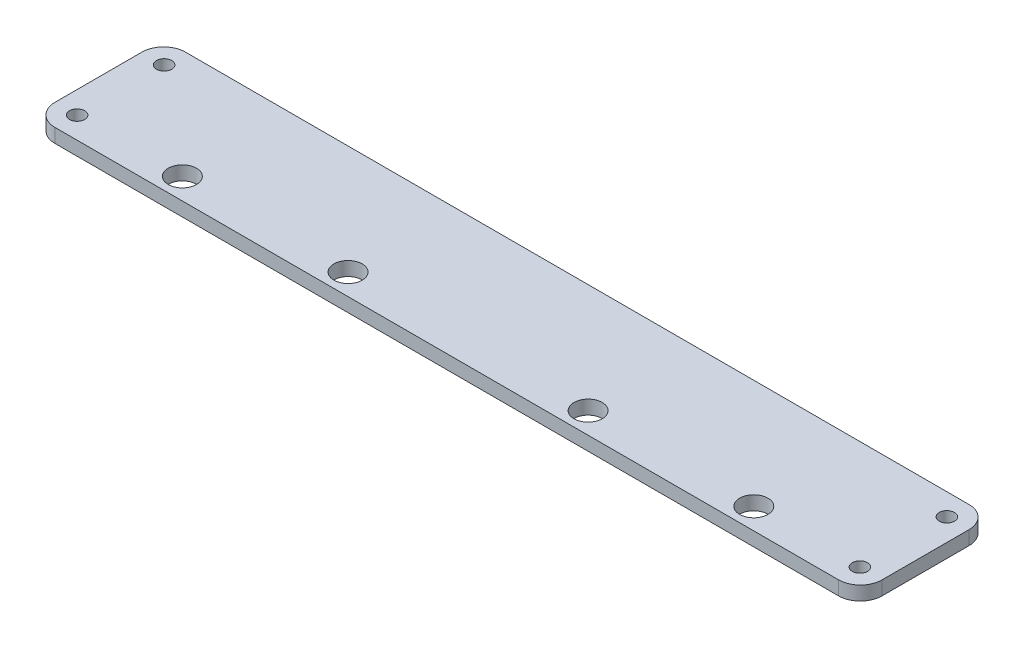
ISO-10303-21;
HEADER;
FILE_DESCRIPTION(('STEP AP214'),'2;1');
FILE_NAME('part.step','',(''),(''),'','','');
FILE_SCHEMA(('AUTOMOTIVE_DESIGN { 1 0 10303 214 1 1 1 1 }'));
ENDSEC;
DATA;
#1=APPLICATION_CONTEXT('core data for automotive mechanical design processes');
#2=APPLICATION_PROTOCOL_DEFINITION('international standard','automotive_design',2000,#1);
#3=PRODUCT_CONTEXT('',#1,'mechanical');
#4=PRODUCT('Part','Part','',(#3));
#5=PRODUCT_RELATED_PRODUCT_CATEGORY('part','',(#4));
#6=PRODUCT_DEFINITION_FORMATION('','',#4);
#7=PRODUCT_DEFINITION_CONTEXT('part definition',#1,'design');
#8=PRODUCT_DEFINITION('design','',#6,#7);
#9=PRODUCT_DEFINITION_SHAPE('','',#8);
#10=(LENGTH_UNIT() NAMED_UNIT(*) SI_UNIT(.MILLI.,.METRE.));
#11=(NAMED_UNIT(*) PLANE_ANGLE_UNIT() SI_UNIT($,.RADIAN.));
#12=(NAMED_UNIT(*) SI_UNIT($,.STERADIAN.) SOLID_ANGLE_UNIT());
#13=UNCERTAINTY_MEASURE_WITH_UNIT(LENGTH_MEASURE(1.E-05),#10,'distance_accuracy_value','');
#14=(GEOMETRIC_REPRESENTATION_CONTEXT(3) GLOBAL_UNCERTAINTY_ASSIGNED_CONTEXT((#13)) GLOBAL_UNIT_ASSIGNED_CONTEXT((#10,
#11,#12)) REPRESENTATION_CONTEXT('',''));
#15=CARTESIAN_POINT('',(0.,0.,0.));
#16=DIRECTION('',(0.,0.,1.));
#17=DIRECTION('',(1.,0.,0.));
#18=AXIS2_PLACEMENT_3D('',#15,#16,#17);
#19=CARTESIAN_POINT('',(95.1,3.2,15.));
#20=DIRECTION('',(-1.,0.,0.));
#21=DIRECTION('',(0.,0.,1.));
#22=AXIS2_PLACEMENT_3D('',#19,#20,#21);
#23=PLANE('',#22);
#24=DIRECTION('',(0.,0.,-1.));
#25=VECTOR('',#24,1.);
#26=CARTESIAN_POINT('',(95.1,3.2,15.));
#27=LINE('',#26,#25);
#28=CARTESIAN_POINT('',(95.1,3.2,10.));
#29=VERTEX_POINT('',#28);
#30=CARTESIAN_POINT('',(95.1,3.2,-10.));
#31=VERTEX_POINT('',#30);
#32=EDGE_CURVE('E116',#29,#31,#27,.T.);
#33=ORIENTED_EDGE('',*,*,#32,.F.);
#34=DIRECTION('',(0.,-1.,0.));
#35=VECTOR('',#34,1.);
#36=CARTESIAN_POINT('',(95.1,3.2,10.));
#37=LINE('',#36,#35);
#38=CARTESIAN_POINT('',(95.1,0.,10.));
#39=VERTEX_POINT('',#38);
#40=EDGE_CURVE('E101',#29,#39,#37,.T.);
#41=ORIENTED_EDGE('',*,*,#40,.T.);
#42=DIRECTION('',(0.,0.,-1.));
#43=VECTOR('',#42,1.);
#44=CARTESIAN_POINT('',(95.1,0.,15.));
#45=LINE('',#44,#43);
#46=CARTESIAN_POINT('',(95.1,0.,-10.));
#47=VERTEX_POINT('',#46);
#48=EDGE_CURVE('E113',#39,#47,#45,.T.);
#49=ORIENTED_EDGE('',*,*,#48,.T.);
#50=DIRECTION('',(0.,-1.,0.));
#51=VECTOR('',#50,1.);
#52=CARTESIAN_POINT('',(95.1,3.2,-10.));
#53=LINE('',#52,#51);
#54=EDGE_CURVE('E118',#47,#31,#53,.F.);
#55=ORIENTED_EDGE('',*,*,#54,.T.);
#56=EDGE_LOOP('',(#33,#41,#49,#55));
#57=FACE_BOUND('',#56,.T.);
#58=ADVANCED_FACE('F32',(#57),#23,.F.);
#59=CARTESIAN_POINT('',(-95.1,3.2,-15.));
#60=DIRECTION('',(0.,0.,1.));
#61=DIRECTION('',(1.,0.,0.));
#62=AXIS2_PLACEMENT_3D('',#59,#60,#61);
#63=PLANE('',#62);
#64=DIRECTION('',(-1.,0.,0.));
#65=VECTOR('',#64,1.);
#66=CARTESIAN_POINT('',(-95.1,3.2,-15.));
#67=LINE('',#66,#65);
#68=CARTESIAN_POINT('',(90.0999999999999,3.2,-15.));
#69=VERTEX_POINT('',#68);
#70=CARTESIAN_POINT('',(-90.1,3.2,-15.));
#71=VERTEX_POINT('',#70);
#72=EDGE_CURVE('E171',#69,#71,#67,.T.);
#73=ORIENTED_EDGE('',*,*,#72,.F.);
#74=DIRECTION('',(0.,-1.,0.));
#75=VECTOR('',#74,1.);
#76=CARTESIAN_POINT('',(90.1,3.2,-15.));
#77=LINE('',#76,#75);
#78=CARTESIAN_POINT('',(90.0999999999999,0.,-15.));
#79=VERTEX_POINT('',#78);
#80=EDGE_CURVE('E155',#69,#79,#77,.T.);
#81=ORIENTED_EDGE('',*,*,#80,.T.);
#82=DIRECTION('',(-1.,0.,0.));
#83=VECTOR('',#82,1.);
#84=CARTESIAN_POINT('',(-95.1,0.,-15.));
#85=LINE('',#84,#83);
#86=CARTESIAN_POINT('',(-90.1,0.,-15.));
#87=VERTEX_POINT('',#86);
#88=EDGE_CURVE('E122',#79,#87,#85,.T.);
#89=ORIENTED_EDGE('',*,*,#88,.T.);
#90=DIRECTION('',(0.,-1.,0.));
#91=VECTOR('',#90,1.);
#92=CARTESIAN_POINT('',(-90.1,3.2,-15.));
#93=LINE('',#92,#91);
#94=EDGE_CURVE('E153',#87,#71,#93,.F.);
#95=ORIENTED_EDGE('',*,*,#94,.T.);
#96=EDGE_LOOP('',(#73,#81,#89,#95));
#97=FACE_BOUND('',#96,.T.);
#98=ADVANCED_FACE('F262',(#97),#63,.F.);
#99=CARTESIAN_POINT('',(-95.1,3.2,15.));
#100=DIRECTION('',(1.,0.,0.));
#101=DIRECTION('',(0.,0.,-1.));
#102=AXIS2_PLACEMENT_3D('',#99,#100,#101);
#103=PLANE('',#102);
#104=DIRECTION('',(0.,0.,1.));
#105=VECTOR('',#104,1.);
#106=CARTESIAN_POINT('',(-95.1,0.,15.));
#107=LINE('',#106,#105);
#108=CARTESIAN_POINT('',(-95.1,0.,-10.));
#109=VERTEX_POINT('',#108);
#110=CARTESIAN_POINT('',(-95.1,0.,10.));
#111=VERTEX_POINT('',#110);
#112=EDGE_CURVE('E126',#109,#111,#107,.T.);
#113=ORIENTED_EDGE('',*,*,#112,.T.);
#114=DIRECTION('',(0.,-1.,0.));
#115=VECTOR('',#114,1.);
#116=CARTESIAN_POINT('',(-95.1,3.2,10.));
#117=LINE('',#116,#115);
#118=CARTESIAN_POINT('',(-95.1,3.2,10.));
#119=VERTEX_POINT('',#118);
#120=EDGE_CURVE('E11',#111,#119,#117,.F.);
#121=ORIENTED_EDGE('',*,*,#120,.T.);
#122=DIRECTION('',(0.,0.,1.));
#123=VECTOR('',#122,1.);
#124=CARTESIAN_POINT('',(-95.1,3.2,15.));
#125=LINE('',#124,#123);
#126=CARTESIAN_POINT('',(-95.1,3.2,-10.));
#127=VERTEX_POINT('',#126);
#128=EDGE_CURVE('E161',#127,#119,#125,.T.);
#129=ORIENTED_EDGE('',*,*,#128,.F.);
#130=DIRECTION('',(0.,-1.,0.));
#131=VECTOR('',#130,1.);
#132=CARTESIAN_POINT('',(-95.1,3.2,-10.));
#133=LINE('',#132,#131);
#134=EDGE_CURVE('E40',#127,#109,#133,.T.);
#135=ORIENTED_EDGE('',*,*,#134,.T.);
#136=EDGE_LOOP('',(#113,#121,#129,#135));
#137=FACE_BOUND('',#136,.T.);
#138=ADVANCED_FACE('F160',(#137),#103,.F.);
#139=CARTESIAN_POINT('',(-95.1,3.2,15.));
#140=DIRECTION('',(0.,0.,-1.));
#141=DIRECTION('',(-1.,0.,0.));
#142=AXIS2_PLACEMENT_3D('',#139,#140,#141);
#143=PLANE('',#142);
#144=DIRECTION('',(1.,0.,0.));
#145=VECTOR('',#144,1.);
#146=CARTESIAN_POINT('',(-95.1,0.,15.));
#147=LINE('',#146,#145);
#148=CARTESIAN_POINT('',(-90.1,0.,15.));
#149=VERTEX_POINT('',#148);
#150=CARTESIAN_POINT('',(90.0999999999999,0.,15.));
#151=VERTEX_POINT('',#150);
#152=EDGE_CURVE('E136',#149,#151,#147,.T.);
#153=ORIENTED_EDGE('',*,*,#152,.T.);
#154=DIRECTION('',(0.,-1.,0.));
#155=VECTOR('',#154,1.);
#156=CARTESIAN_POINT('',(90.1,3.2,15.));
#157=LINE('',#156,#155);
#158=CARTESIAN_POINT('',(90.0999999999999,3.2,15.));
#159=VERTEX_POINT('',#158);
#160=EDGE_CURVE('E102',#151,#159,#157,.F.);
#161=ORIENTED_EDGE('',*,*,#160,.T.);
#162=DIRECTION('',(1.,0.,0.));
#163=VECTOR('',#162,1.);
#164=CARTESIAN_POINT('',(-95.1,3.2,15.));
#165=LINE('',#164,#163);
#166=CARTESIAN_POINT('',(-90.1,3.2,15.));
#167=VERTEX_POINT('',#166);
#168=EDGE_CURVE('E132',#167,#159,#165,.T.);
#169=ORIENTED_EDGE('',*,*,#168,.F.);
#170=DIRECTION('',(0.,-1.,0.));
#171=VECTOR('',#170,1.);
#172=CARTESIAN_POINT('',(-90.1,3.2,15.));
#173=LINE('',#172,#171);
#174=EDGE_CURVE('E107',#167,#149,#173,.T.);
#175=ORIENTED_EDGE('',*,*,#174,.T.);
#176=EDGE_LOOP('',(#153,#161,#169,#175));
#177=FACE_BOUND('',#176,.T.);
#178=ADVANCED_FACE('F169',(#177),#143,.F.);
#179=CARTESIAN_POINT('',(0.,3.2,0.));
#180=DIRECTION('',(0.,-1.,0.));
#181=DIRECTION('',(0.,0.,-1.));
#182=AXIS2_PLACEMENT_3D('',#179,#180,#181);
#183=PLANE('',#182);
#184=CARTESIAN_POINT('',(27.6,3.2,10.1));
#185=DIRECTION('',(0.,1.,0.));
#186=DIRECTION('',(0.,0.,1.));
#187=AXIS2_PLACEMENT_3D('',#184,#185,#186);
#188=CIRCLE('',#187,3.25);
#189=CARTESIAN_POINT('',(27.6,3.2,13.35));
#190=VERTEX_POINT('',#189);
#191=EDGE_CURVE('E214',#190,#190,#188,.T.);
#192=ORIENTED_EDGE('',*,*,#191,.F.);
#193=EDGE_LOOP('',(#192));
#194=FACE_BOUND('',#193,.T.);
#195=CARTESIAN_POINT('',(-27.6,3.2,10.1));
#196=DIRECTION('',(0.,1.,0.));
#197=DIRECTION('',(0.,0.,1.));
#198=AXIS2_PLACEMENT_3D('',#195,#196,#197);
#199=CIRCLE('',#198,3.25);
#200=CARTESIAN_POINT('',(-27.6,3.2,13.35));
#201=VERTEX_POINT('',#200);
#202=EDGE_CURVE('E208',#201,#201,#199,.T.);
#203=ORIENTED_EDGE('',*,*,#202,.F.);
#204=EDGE_LOOP('',(#203));
#205=FACE_BOUND('',#204,.T.);
#206=CARTESIAN_POINT('',(-65.7,3.2,10.1));
#207=DIRECTION('',(0.,1.,0.));
#208=DIRECTION('',(0.,0.,1.));
#209=AXIS2_PLACEMENT_3D('',#206,#207,#208);
#210=CIRCLE('',#209,3.25000000000001);
#211=CARTESIAN_POINT('',(-65.7,3.2,13.35));
#212=VERTEX_POINT('',#211);
#213=EDGE_CURVE('E202',#212,#212,#210,.T.);
#214=ORIENTED_EDGE('',*,*,#213,.F.);
#215=EDGE_LOOP('',(#214));
#216=FACE_BOUND('',#215,.T.);
#217=CARTESIAN_POINT('',(65.7,3.2,10.1));
#218=DIRECTION('',(0.,1.,0.));
#219=DIRECTION('',(0.,0.,1.));
#220=AXIS2_PLACEMENT_3D('',#217,#218,#219);
#221=CIRCLE('',#220,3.25000000000001);
#222=CARTESIAN_POINT('',(65.7,3.2,13.35));
#223=VERTEX_POINT('',#222);
#224=EDGE_CURVE('E196',#223,#223,#221,.T.);
#225=ORIENTED_EDGE('',*,*,#224,.F.);
#226=EDGE_LOOP('',(#225));
#227=FACE_BOUND('',#226,.T.);
#228=CARTESIAN_POINT('',(-90.,3.2,10.));
#229=DIRECTION('',(0.,1.,0.));
#230=DIRECTION('',(0.,0.,1.));
#231=AXIS2_PLACEMENT_3D('',#228,#229,#230);
#232=CIRCLE('',#231,1.75);
#233=CARTESIAN_POINT('',(-90.,3.2,11.75));
#234=VERTEX_POINT('',#233);
#235=EDGE_CURVE('E191',#234,#234,#232,.T.);
#236=ORIENTED_EDGE('',*,*,#235,.F.);
#237=EDGE_LOOP('',(#236));
#238=FACE_BOUND('',#237,.T.);
#239=CARTESIAN_POINT('',(90.,3.2,-10.));
#240=DIRECTION('',(0.,1.,0.));
#241=DIRECTION('',(0.,0.,1.));
#242=AXIS2_PLACEMENT_3D('',#239,#240,#241);
#243=CIRCLE('',#242,1.75);
#244=CARTESIAN_POINT('',(90.,3.2,-8.25));
#245=VERTEX_POINT('',#244);
#246=EDGE_CURVE('E185',#245,#245,#243,.T.);
#247=ORIENTED_EDGE('',*,*,#246,.F.);
#248=EDGE_LOOP('',(#247));
#249=FACE_BOUND('',#248,.T.);
#250=CARTESIAN_POINT('',(90.,3.2,10.));
#251=DIRECTION('',(0.,1.,0.));
#252=DIRECTION('',(0.,0.,1.));
#253=AXIS2_PLACEMENT_3D('',#250,#251,#252);
#254=CIRCLE('',#253,1.75);
#255=CARTESIAN_POINT('',(90.,3.2,11.75));
#256=VERTEX_POINT('',#255);
#257=EDGE_CURVE('E178',#256,#256,#254,.T.);
#258=ORIENTED_EDGE('',*,*,#257,.F.);
#259=EDGE_LOOP('',(#258));
#260=FACE_BOUND('',#259,.T.);
#261=CARTESIAN_POINT('',(-90.,3.2,-10.));
#262=DIRECTION('',(0.,1.,0.));
#263=DIRECTION('',(0.,0.,1.));
#264=AXIS2_PLACEMENT_3D('',#261,#262,#263);
#265=CIRCLE('',#264,1.75);
#266=CARTESIAN_POINT('',(-90.,3.2,-8.25));
#267=VERTEX_POINT('',#266);
#268=EDGE_CURVE('E129',#267,#267,#265,.T.);
#269=ORIENTED_EDGE('',*,*,#268,.F.);
#270=EDGE_LOOP('',(#269));
#271=FACE_BOUND('',#270,.T.);
#272=ORIENTED_EDGE('',*,*,#168,.T.);
#273=CARTESIAN_POINT('',(90.1,3.2,10.));
#274=DIRECTION('',(0.,-1.,0.));
#275=DIRECTION('',(0.,0.,-1.));
#276=AXIS2_PLACEMENT_3D('',#273,#274,#275);
#277=CIRCLE('',#276,5.);
#278=EDGE_CURVE('E151',#159,#29,#277,.F.);
#279=ORIENTED_EDGE('',*,*,#278,.T.);
#280=ORIENTED_EDGE('',*,*,#32,.T.);
#281=CARTESIAN_POINT('',(90.1,3.2,-10.));
#282=DIRECTION('',(0.,-1.,0.));
#283=DIRECTION('',(0.,0.,-1.));
#284=AXIS2_PLACEMENT_3D('',#281,#282,#283);
#285=CIRCLE('',#284,5.);
#286=EDGE_CURVE('E149',#31,#69,#285,.F.);
#287=ORIENTED_EDGE('',*,*,#286,.T.);
#288=ORIENTED_EDGE('',*,*,#72,.T.);
#289=CARTESIAN_POINT('',(-90.1,3.2,-10.));
#290=DIRECTION('',(0.,-1.,0.));
#291=DIRECTION('',(0.,0.,-1.));
#292=AXIS2_PLACEMENT_3D('',#289,#290,#291);
#293=CIRCLE('',#292,5.);
#294=EDGE_CURVE('E52',#71,#127,#293,.F.);
#295=ORIENTED_EDGE('',*,*,#294,.T.);
#296=ORIENTED_EDGE('',*,*,#128,.T.);
#297=CARTESIAN_POINT('',(-90.1,3.2,10.));
#298=DIRECTION('',(0.,-1.,0.));
#299=DIRECTION('',(0.,0.,-1.));
#300=AXIS2_PLACEMENT_3D('',#297,#298,#299);
#301=CIRCLE('',#300,5.);
#302=EDGE_CURVE('E147',#119,#167,#301,.F.);
#303=ORIENTED_EDGE('',*,*,#302,.T.);
#304=EDGE_LOOP('',(#272,#279,#280,#287,#288,#295,#296,#303));
#305=FACE_BOUND('',#304,.T.);
#306=ADVANCED_FACE('F229',(#194,#205,#216,#227,#238,#249,#260,#271,#305),#183,.F.);
#307=CARTESIAN_POINT('',(0.,0.,0.));
#308=DIRECTION('',(0.,-1.,0.));
#309=DIRECTION('',(0.,0.,-1.));
#310=AXIS2_PLACEMENT_3D('',#307,#308,#309);
#311=PLANE('',#310);
#312=CARTESIAN_POINT('',(27.6,0.,10.1));
#313=DIRECTION('',(0.,1.,0.));
#314=DIRECTION('',(0.,0.,1.));
#315=AXIS2_PLACEMENT_3D('',#312,#313,#314);
#316=CIRCLE('',#315,3.25);
#317=CARTESIAN_POINT('',(27.6,0.,13.35));
#318=VERTEX_POINT('',#317);
#319=EDGE_CURVE('E199',#318,#318,#316,.T.);
#320=ORIENTED_EDGE('',*,*,#319,.T.);
#321=EDGE_LOOP('',(#320));
#322=FACE_BOUND('',#321,.T.);
#323=CARTESIAN_POINT('',(-27.6,0.,10.1));
#324=DIRECTION('',(0.,1.,0.));
#325=DIRECTION('',(0.,0.,1.));
#326=AXIS2_PLACEMENT_3D('',#323,#324,#325);
#327=CIRCLE('',#326,3.25);
#328=CARTESIAN_POINT('',(-27.6,0.,13.35));
#329=VERTEX_POINT('',#328);
#330=EDGE_CURVE('E211',#329,#329,#327,.T.);
#331=ORIENTED_EDGE('',*,*,#330,.T.);
#332=EDGE_LOOP('',(#331));
#333=FACE_BOUND('',#332,.T.);
#334=CARTESIAN_POINT('',(-65.7,0.,10.1));
#335=DIRECTION('',(0.,1.,0.));
#336=DIRECTION('',(0.,0.,1.));
#337=AXIS2_PLACEMENT_3D('',#334,#335,#336);
#338=CIRCLE('',#337,3.25000000000001);
#339=CARTESIAN_POINT('',(-65.7,0.,13.35));
#340=VERTEX_POINT('',#339);
#341=EDGE_CURVE('E205',#340,#340,#338,.T.);
#342=ORIENTED_EDGE('',*,*,#341,.T.);
#343=EDGE_LOOP('',(#342));
#344=FACE_BOUND('',#343,.T.);
#345=CARTESIAN_POINT('',(65.7,0.,10.1));
#346=DIRECTION('',(0.,1.,0.));
#347=DIRECTION('',(0.,0.,1.));
#348=AXIS2_PLACEMENT_3D('',#345,#346,#347);
#349=CIRCLE('',#348,3.25000000000001);
#350=CARTESIAN_POINT('',(65.7,0.,13.35));
#351=VERTEX_POINT('',#350);
#352=EDGE_CURVE('E182',#351,#351,#349,.T.);
#353=ORIENTED_EDGE('',*,*,#352,.T.);
#354=EDGE_LOOP('',(#353));
#355=FACE_BOUND('',#354,.T.);
#356=CARTESIAN_POINT('',(-90.,0.,10.));
#357=DIRECTION('',(0.,1.,0.));
#358=DIRECTION('',(0.,0.,1.));
#359=AXIS2_PLACEMENT_3D('',#356,#357,#358);
#360=CIRCLE('',#359,1.75);
#361=CARTESIAN_POINT('',(-90.,0.,11.75));
#362=VERTEX_POINT('',#361);
#363=EDGE_CURVE('E176',#362,#362,#360,.T.);
#364=ORIENTED_EDGE('',*,*,#363,.T.);
#365=EDGE_LOOP('',(#364));
#366=FACE_BOUND('',#365,.T.);
#367=CARTESIAN_POINT('',(90.,0.,-10.));
#368=DIRECTION('',(0.,1.,0.));
#369=DIRECTION('',(0.,0.,1.));
#370=AXIS2_PLACEMENT_3D('',#367,#368,#369);
#371=CIRCLE('',#370,1.75);
#372=CARTESIAN_POINT('',(90.,0.,-8.25));
#373=VERTEX_POINT('',#372);
#374=EDGE_CURVE('E188',#373,#373,#371,.T.);
#375=ORIENTED_EDGE('',*,*,#374,.T.);
#376=EDGE_LOOP('',(#375));
#377=FACE_BOUND('',#376,.T.);
#378=CARTESIAN_POINT('',(90.,0.,10.));
#379=DIRECTION('',(0.,1.,0.));
#380=DIRECTION('',(0.,0.,1.));
#381=AXIS2_PLACEMENT_3D('',#378,#379,#380);
#382=CIRCLE('',#381,1.75);
#383=CARTESIAN_POINT('',(90.,0.,11.75));
#384=VERTEX_POINT('',#383);
#385=EDGE_CURVE('E181',#384,#384,#382,.T.);
#386=ORIENTED_EDGE('',*,*,#385,.T.);
#387=EDGE_LOOP('',(#386));
#388=FACE_BOUND('',#387,.T.);
#389=CARTESIAN_POINT('',(-90.,0.,-10.));
#390=DIRECTION('',(0.,1.,0.));
#391=DIRECTION('',(0.,0.,1.));
#392=AXIS2_PLACEMENT_3D('',#389,#390,#391);
#393=CIRCLE('',#392,1.75);
#394=CARTESIAN_POINT('',(-90.,0.,-8.25));
#395=VERTEX_POINT('',#394);
#396=EDGE_CURVE('E123',#395,#395,#393,.T.);
#397=ORIENTED_EDGE('',*,*,#396,.T.);
#398=EDGE_LOOP('',(#397));
#399=FACE_BOUND('',#398,.T.);
#400=ORIENTED_EDGE('',*,*,#48,.F.);
#401=CARTESIAN_POINT('',(90.1,0.,10.));
#402=DIRECTION('',(0.,-1.,0.));
#403=DIRECTION('',(0.,0.,-1.));
#404=AXIS2_PLACEMENT_3D('',#401,#402,#403);
#405=CIRCLE('',#404,5.);
#406=EDGE_CURVE('E97',#39,#151,#405,.T.);
#407=ORIENTED_EDGE('',*,*,#406,.T.);
#408=ORIENTED_EDGE('',*,*,#152,.F.);
#409=CARTESIAN_POINT('',(-90.1,0.,10.));
#410=DIRECTION('',(0.,-1.,0.));
#411=DIRECTION('',(0.,0.,-1.));
#412=AXIS2_PLACEMENT_3D('',#409,#410,#411);
#413=CIRCLE('',#412,5.);
#414=EDGE_CURVE('E140',#149,#111,#413,.T.);
#415=ORIENTED_EDGE('',*,*,#414,.T.);
#416=ORIENTED_EDGE('',*,*,#112,.F.);
#417=CARTESIAN_POINT('',(-90.1,0.,-10.));
#418=DIRECTION('',(0.,-1.,0.));
#419=DIRECTION('',(0.,0.,-1.));
#420=AXIS2_PLACEMENT_3D('',#417,#418,#419);
#421=CIRCLE('',#420,5.);
#422=EDGE_CURVE('E117',#109,#87,#421,.T.);
#423=ORIENTED_EDGE('',*,*,#422,.T.);
#424=ORIENTED_EDGE('',*,*,#88,.F.);
#425=CARTESIAN_POINT('',(90.1,0.,-10.));
#426=DIRECTION('',(0.,-1.,0.));
#427=DIRECTION('',(0.,0.,-1.));
#428=AXIS2_PLACEMENT_3D('',#425,#426,#427);
#429=CIRCLE('',#428,5.);
#430=EDGE_CURVE('E108',#79,#47,#429,.T.);
#431=ORIENTED_EDGE('',*,*,#430,.T.);
#432=EDGE_LOOP('',(#400,#407,#408,#415,#416,#423,#424,#431));
#433=FACE_BOUND('',#432,.T.);
#434=ADVANCED_FACE('F120',(#322,#333,#344,#355,#366,#377,#388,#399,#433),#311,.T.);
#435=CARTESIAN_POINT('',(-90.,0.,-10.));
#436=DIRECTION('',(0.,1.,0.));
#437=DIRECTION('',(0.,0.,1.));
#438=AXIS2_PLACEMENT_3D('',#435,#436,#437);
#439=CYLINDRICAL_SURFACE('',#438,1.75);
#440=ORIENTED_EDGE('',*,*,#396,.F.);
#441=EDGE_LOOP('',(#440));
#442=FACE_BOUND('',#441,.T.);
#443=ORIENTED_EDGE('',*,*,#268,.T.);
#444=EDGE_LOOP('',(#443));
#445=FACE_BOUND('',#444,.T.);
#446=ADVANCED_FACE('F247',(#442,#445),#439,.F.);
#447=CARTESIAN_POINT('',(90.,0.,10.));
#448=DIRECTION('',(0.,1.,0.));
#449=DIRECTION('',(0.,0.,1.));
#450=AXIS2_PLACEMENT_3D('',#447,#448,#449);
#451=CYLINDRICAL_SURFACE('',#450,1.75);
#452=ORIENTED_EDGE('',*,*,#385,.F.);
#453=EDGE_LOOP('',(#452));
#454=FACE_BOUND('',#453,.T.);
#455=ORIENTED_EDGE('',*,*,#257,.T.);
#456=EDGE_LOOP('',(#455));
#457=FACE_BOUND('',#456,.T.);
#458=ADVANCED_FACE('F249',(#454,#457),#451,.F.);
#459=CARTESIAN_POINT('',(90.,0.,-10.));
#460=DIRECTION('',(0.,1.,0.));
#461=DIRECTION('',(0.,0.,1.));
#462=AXIS2_PLACEMENT_3D('',#459,#460,#461);
#463=CYLINDRICAL_SURFACE('',#462,1.75);
#464=ORIENTED_EDGE('',*,*,#374,.F.);
#465=EDGE_LOOP('',(#464));
#466=FACE_BOUND('',#465,.T.);
#467=ORIENTED_EDGE('',*,*,#246,.T.);
#468=EDGE_LOOP('',(#467));
#469=FACE_BOUND('',#468,.T.);
#470=ADVANCED_FACE('F256',(#466,#469),#463,.F.);
#471=CARTESIAN_POINT('',(-90.,0.,10.));
#472=DIRECTION('',(0.,1.,0.));
#473=DIRECTION('',(0.,0.,1.));
#474=AXIS2_PLACEMENT_3D('',#471,#472,#473);
#475=CYLINDRICAL_SURFACE('',#474,1.75);
#476=ORIENTED_EDGE('',*,*,#363,.F.);
#477=EDGE_LOOP('',(#476));
#478=FACE_BOUND('',#477,.T.);
#479=ORIENTED_EDGE('',*,*,#235,.T.);
#480=EDGE_LOOP('',(#479));
#481=FACE_BOUND('',#480,.T.);
#482=ADVANCED_FACE('F375',(#478,#481),#475,.F.);
#483=CARTESIAN_POINT('',(65.7,0.,10.1));
#484=DIRECTION('',(0.,1.,0.));
#485=DIRECTION('',(0.,0.,1.));
#486=AXIS2_PLACEMENT_3D('',#483,#484,#485);
#487=CYLINDRICAL_SURFACE('',#486,3.25000000000001);
#488=ORIENTED_EDGE('',*,*,#352,.F.);
#489=EDGE_LOOP('',(#488));
#490=FACE_BOUND('',#489,.T.);
#491=ORIENTED_EDGE('',*,*,#224,.T.);
#492=EDGE_LOOP('',(#491));
#493=FACE_BOUND('',#492,.T.);
#494=ADVANCED_FACE('F365',(#490,#493),#487,.F.);
#495=CARTESIAN_POINT('',(-65.7,0.,10.1));
#496=DIRECTION('',(0.,1.,0.));
#497=DIRECTION('',(0.,0.,1.));
#498=AXIS2_PLACEMENT_3D('',#495,#496,#497);
#499=CYLINDRICAL_SURFACE('',#498,3.25000000000001);
#500=ORIENTED_EDGE('',*,*,#341,.F.);
#501=EDGE_LOOP('',(#500));
#502=FACE_BOUND('',#501,.T.);
#503=ORIENTED_EDGE('',*,*,#213,.T.);
#504=EDGE_LOOP('',(#503));
#505=FACE_BOUND('',#504,.T.);
#506=ADVANCED_FACE('F355',(#502,#505),#499,.F.);
#507=CARTESIAN_POINT('',(-27.6,0.,10.1));
#508=DIRECTION('',(0.,1.,0.));
#509=DIRECTION('',(0.,0.,1.));
#510=AXIS2_PLACEMENT_3D('',#507,#508,#509);
#511=CYLINDRICAL_SURFACE('',#510,3.25);
#512=ORIENTED_EDGE('',*,*,#330,.F.);
#513=EDGE_LOOP('',(#512));
#514=FACE_BOUND('',#513,.T.);
#515=ORIENTED_EDGE('',*,*,#202,.T.);
#516=EDGE_LOOP('',(#515));
#517=FACE_BOUND('',#516,.T.);
#518=ADVANCED_FACE('F225',(#514,#517),#511,.F.);
#519=CARTESIAN_POINT('',(27.6,0.,10.1));
#520=DIRECTION('',(0.,1.,0.));
#521=DIRECTION('',(0.,0.,1.));
#522=AXIS2_PLACEMENT_3D('',#519,#520,#521);
#523=CYLINDRICAL_SURFACE('',#522,3.25);
#524=ORIENTED_EDGE('',*,*,#319,.F.);
#525=EDGE_LOOP('',(#524));
#526=FACE_BOUND('',#525,.T.);
#527=ORIENTED_EDGE('',*,*,#191,.T.);
#528=EDGE_LOOP('',(#527));
#529=FACE_BOUND('',#528,.T.);
#530=ADVANCED_FACE('F222',(#526,#529),#523,.F.);
#531=CARTESIAN_POINT('',(90.1,3.2,10.));
#532=DIRECTION('',(0.,-1.,0.));
#533=DIRECTION('',(0.,0.,-1.));
#534=AXIS2_PLACEMENT_3D('',#531,#532,#533);
#535=CYLINDRICAL_SURFACE('',#534,5.);
#536=ORIENTED_EDGE('',*,*,#278,.F.);
#537=ORIENTED_EDGE('',*,*,#160,.F.);
#538=ORIENTED_EDGE('',*,*,#406,.F.);
#539=ORIENTED_EDGE('',*,*,#40,.F.);
#540=EDGE_LOOP('',(#536,#537,#538,#539));
#541=FACE_BOUND('',#540,.T.);
#542=ADVANCED_FACE('F100',(#541),#535,.T.);
#543=CARTESIAN_POINT('',(90.1,3.2,-10.));
#544=DIRECTION('',(0.,-1.,0.));
#545=DIRECTION('',(0.,0.,-1.));
#546=AXIS2_PLACEMENT_3D('',#543,#544,#545);
#547=CYLINDRICAL_SURFACE('',#546,5.);
#548=ORIENTED_EDGE('',*,*,#286,.F.);
#549=ORIENTED_EDGE('',*,*,#54,.F.);
#550=ORIENTED_EDGE('',*,*,#430,.F.);
#551=ORIENTED_EDGE('',*,*,#80,.F.);
#552=EDGE_LOOP('',(#548,#549,#550,#551));
#553=FACE_BOUND('',#552,.T.);
#554=ADVANCED_FACE('F273',(#553),#547,.T.);
#555=CARTESIAN_POINT('',(-90.1,3.2,10.));
#556=DIRECTION('',(0.,-1.,0.));
#557=DIRECTION('',(0.,0.,-1.));
#558=AXIS2_PLACEMENT_3D('',#555,#556,#557);
#559=CYLINDRICAL_SURFACE('',#558,5.);
#560=ORIENTED_EDGE('',*,*,#302,.F.);
#561=ORIENTED_EDGE('',*,*,#120,.F.);
#562=ORIENTED_EDGE('',*,*,#414,.F.);
#563=ORIENTED_EDGE('',*,*,#174,.F.);
#564=EDGE_LOOP('',(#560,#561,#562,#563));
#565=FACE_BOUND('',#564,.T.);
#566=ADVANCED_FACE('F166',(#565),#559,.T.);
#567=CARTESIAN_POINT('',(-90.1,3.2,-10.));
#568=DIRECTION('',(0.,-1.,0.));
#569=DIRECTION('',(0.,0.,-1.));
#570=AXIS2_PLACEMENT_3D('',#567,#568,#569);
#571=CYLINDRICAL_SURFACE('',#570,5.);
#572=ORIENTED_EDGE('',*,*,#294,.F.);
#573=ORIENTED_EDGE('',*,*,#94,.F.);
#574=ORIENTED_EDGE('',*,*,#422,.F.);
#575=ORIENTED_EDGE('',*,*,#134,.F.);
#576=EDGE_LOOP('',(#572,#573,#574,#575));
#577=FACE_BOUND('',#576,.T.);
#578=ADVANCED_FACE('F34',(#577),#571,.T.);
#579=CLOSED_SHELL('',(#58,#98,#138,#178,#306,#434,#446,#458,#470,#482,#494,#506,#518,#530,#542,
#554,#566,#578));
#580=MANIFOLD_SOLID_BREP('B2',#579);
#581=ADVANCED_BREP_SHAPE_REPRESENTATION('',(#18,#580),#14);
#582=SHAPE_DEFINITION_REPRESENTATION(#9,#581);
ENDSEC;
END-ISO-10303-21;
